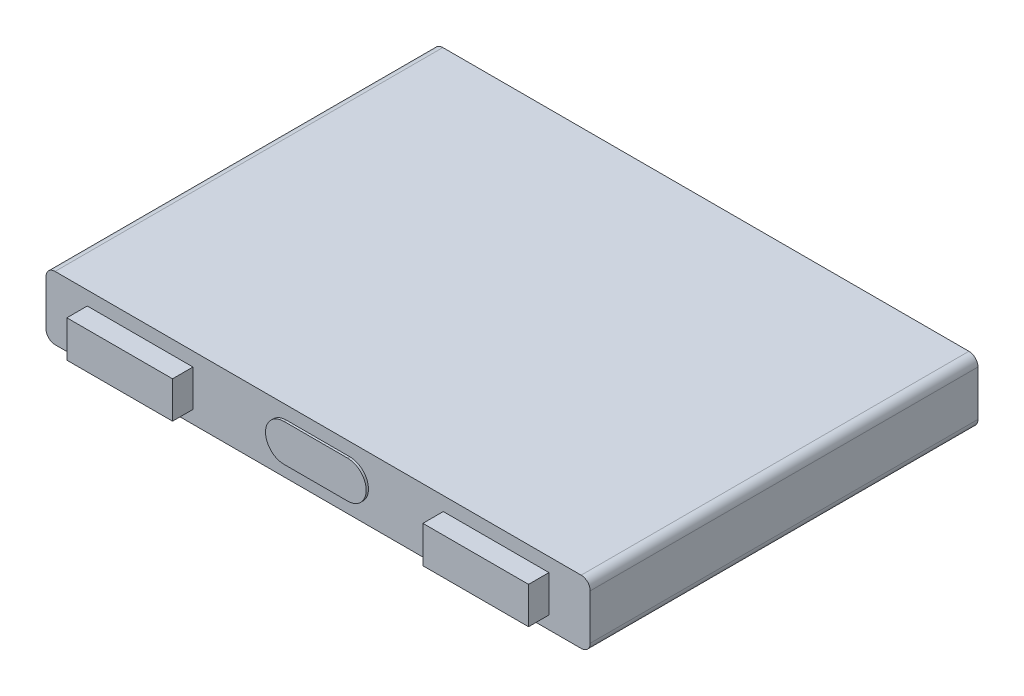
ISO-10303-21;
HEADER;
FILE_DESCRIPTION(('STEP AP214'),'2;1');
FILE_NAME('part.step','',(''),(''),'','','');
FILE_SCHEMA(('AUTOMOTIVE_DESIGN { 1 0 10303 214 1 1 1 1 }'));
ENDSEC;
DATA;
#1=APPLICATION_CONTEXT('core data for automotive mechanical design processes');
#2=APPLICATION_PROTOCOL_DEFINITION('international standard','automotive_design',2000,#1);
#3=PRODUCT_CONTEXT('',#1,'mechanical');
#4=PRODUCT('Part','Part','',(#3));
#5=PRODUCT_RELATED_PRODUCT_CATEGORY('part','',(#4));
#6=PRODUCT_DEFINITION_FORMATION('','',#4);
#7=PRODUCT_DEFINITION_CONTEXT('part definition',#1,'design');
#8=PRODUCT_DEFINITION('design','',#6,#7);
#9=PRODUCT_DEFINITION_SHAPE('','',#8);
#10=(LENGTH_UNIT() NAMED_UNIT(*) SI_UNIT(.MILLI.,.METRE.));
#11=(NAMED_UNIT(*) PLANE_ANGLE_UNIT() SI_UNIT($,.RADIAN.));
#12=(NAMED_UNIT(*) SI_UNIT($,.STERADIAN.) SOLID_ANGLE_UNIT());
#13=UNCERTAINTY_MEASURE_WITH_UNIT(LENGTH_MEASURE(1.E-05),#10,'distance_accuracy_value','');
#14=(GEOMETRIC_REPRESENTATION_CONTEXT(3) GLOBAL_UNCERTAINTY_ASSIGNED_CONTEXT((#13)) GLOBAL_UNIT_ASSIGNED_CONTEXT((#10,
#11,#12)) REPRESENTATION_CONTEXT('',''));
#15=CARTESIAN_POINT('',(0.,0.,0.));
#16=DIRECTION('',(0.,0.,1.));
#17=DIRECTION('',(1.,0.,0.));
#18=AXIS2_PLACEMENT_3D('',#15,#16,#17);
#19=CARTESIAN_POINT('',(-60.,14.,42.75));
#20=DIRECTION('',(0.,0.,-1.));
#21=DIRECTION('',(-1.,0.,0.));
#22=AXIS2_PLACEMENT_3D('',#19,#20,#21);
#23=PLANE('',#22);
#24=DIRECTION('',(1.,0.,0.));
#25=VECTOR('',#24,1.);
#26=CARTESIAN_POINT('',(0.,2.9,42.75));
#27=LINE('',#26,#25);
#28=CARTESIAN_POINT('',(-7.,2.9,42.75));
#29=VERTEX_POINT('',#28);
#30=CARTESIAN_POINT('',(7.,2.9,42.75));
#31=VERTEX_POINT('',#30);
#32=EDGE_CURVE('E202',#29,#31,#27,.T.);
#33=ORIENTED_EDGE('',*,*,#32,.F.);
#34=CARTESIAN_POINT('',(-7.,7.,42.75));
#35=DIRECTION('',(0.,0.,1.));
#36=DIRECTION('',(1.,0.,0.));
#37=AXIS2_PLACEMENT_3D('',#34,#35,#36);
#38=CIRCLE('',#37,4.1);
#39=CARTESIAN_POINT('',(-7.,11.1,42.75));
#40=VERTEX_POINT('',#39);
#41=EDGE_CURVE('E199',#40,#29,#38,.T.);
#42=ORIENTED_EDGE('',*,*,#41,.F.);
#43=DIRECTION('',(1.,0.,0.));
#44=VECTOR('',#43,1.);
#45=CARTESIAN_POINT('',(0.,11.1,42.75));
#46=LINE('',#45,#44);
#47=CARTESIAN_POINT('',(7.,11.1,42.75));
#48=VERTEX_POINT('',#47);
#49=EDGE_CURVE('E62',#40,#48,#46,.T.);
#50=ORIENTED_EDGE('',*,*,#49,.T.);
#51=CARTESIAN_POINT('',(7.,7.,42.75));
#52=DIRECTION('',(0.,0.,1.));
#53=DIRECTION('',(1.,0.,0.));
#54=AXIS2_PLACEMENT_3D('',#51,#52,#53);
#55=CIRCLE('',#54,4.1);
#56=EDGE_CURVE('E57',#31,#48,#55,.T.);
#57=ORIENTED_EDGE('',*,*,#56,.F.);
#58=EDGE_LOOP('',(#33,#42,#50,#57));
#59=FACE_BOUND('',#58,.T.);
#60=DIRECTION('',(0.,-1.,0.));
#61=VECTOR('',#60,1.);
#62=CARTESIAN_POINT('',(-50.9,2.84456170119811,42.75));
#63=LINE('',#62,#61);
#64=CARTESIAN_POINT('',(-50.9,10.9445617011981,42.75));
#65=VERTEX_POINT('',#64);
#66=CARTESIAN_POINT('',(-50.9,2.84456170119811,42.75));
#67=VERTEX_POINT('',#66);
#68=EDGE_CURVE('E255',#65,#67,#63,.T.);
#69=ORIENTED_EDGE('',*,*,#68,.F.);
#70=DIRECTION('',(-1.,0.,0.));
#71=VECTOR('',#70,1.);
#72=CARTESIAN_POINT('',(-27.6,10.9445617011981,42.75));
#73=LINE('',#72,#71);
#74=CARTESIAN_POINT('',(-27.6,10.9445617011981,42.75));
#75=VERTEX_POINT('',#74);
#76=EDGE_CURVE('E261',#75,#65,#73,.T.);
#77=ORIENTED_EDGE('',*,*,#76,.F.);
#78=DIRECTION('',(0.,1.,0.));
#79=VECTOR('',#78,1.);
#80=CARTESIAN_POINT('',(-27.6,2.84456170119811,42.75));
#81=LINE('',#80,#79);
#82=CARTESIAN_POINT('',(-27.6,2.84456170119811,42.75));
#83=VERTEX_POINT('',#82);
#84=EDGE_CURVE('E278',#83,#75,#81,.T.);
#85=ORIENTED_EDGE('',*,*,#84,.F.);
#86=DIRECTION('',(1.,0.,0.));
#87=VECTOR('',#86,1.);
#88=CARTESIAN_POINT('',(-27.6,2.84456170119811,42.75));
#89=LINE('',#88,#87);
#90=EDGE_CURVE('E274',#67,#83,#89,.T.);
#91=ORIENTED_EDGE('',*,*,#90,.F.);
#92=EDGE_LOOP('',(#69,#77,#85,#91));
#93=FACE_BOUND('',#92,.T.);
#94=DIRECTION('',(1.,0.,0.));
#95=VECTOR('',#94,1.);
#96=CARTESIAN_POINT('',(-60.,14.,42.75));
#97=LINE('',#96,#95);
#98=CARTESIAN_POINT('',(-58.,14.,42.75));
#99=VERTEX_POINT('',#98);
#100=CARTESIAN_POINT('',(58.,14.,42.75));
#101=VERTEX_POINT('',#100);
#102=EDGE_CURVE('E305',#99,#101,#97,.T.);
#103=ORIENTED_EDGE('',*,*,#102,.F.);
#104=CARTESIAN_POINT('',(-58.,12.,42.75));
#105=DIRECTION('',(0.,0.,-1.));
#106=DIRECTION('',(-1.,0.,0.));
#107=AXIS2_PLACEMENT_3D('',#104,#105,#106);
#108=CIRCLE('',#107,2.);
#109=CARTESIAN_POINT('',(-60.,12.,42.75));
#110=VERTEX_POINT('',#109);
#111=EDGE_CURVE('E349',#99,#110,#108,.F.);
#112=ORIENTED_EDGE('',*,*,#111,.T.);
#113=DIRECTION('',(0.,-1.,0.));
#114=VECTOR('',#113,1.);
#115=CARTESIAN_POINT('',(-60.,14.,42.75));
#116=LINE('',#115,#114);
#117=CARTESIAN_POINT('',(-60.,2.,42.75));
#118=VERTEX_POINT('',#117);
#119=EDGE_CURVE('E320',#110,#118,#116,.T.);
#120=ORIENTED_EDGE('',*,*,#119,.T.);
#121=CARTESIAN_POINT('',(-58.,2.,42.75));
#122=DIRECTION('',(0.,0.,-1.));
#123=DIRECTION('',(-1.,0.,0.));
#124=AXIS2_PLACEMENT_3D('',#121,#122,#123);
#125=CIRCLE('',#124,2.);
#126=CARTESIAN_POINT('',(-58.,0.,42.75));
#127=VERTEX_POINT('',#126);
#128=EDGE_CURVE('E346',#118,#127,#125,.F.);
#129=ORIENTED_EDGE('',*,*,#128,.T.);
#130=DIRECTION('',(1.,0.,0.));
#131=VECTOR('',#130,1.);
#132=CARTESIAN_POINT('',(-60.,0.,42.75));
#133=LINE('',#132,#131);
#134=CARTESIAN_POINT('',(58.,0.,42.75));
#135=VERTEX_POINT('',#134);
#136=EDGE_CURVE('E306',#127,#135,#133,.T.);
#137=ORIENTED_EDGE('',*,*,#136,.T.);
#138=CARTESIAN_POINT('',(58.,2.,42.75));
#139=DIRECTION('',(0.,0.,-1.));
#140=DIRECTION('',(-1.,0.,0.));
#141=AXIS2_PLACEMENT_3D('',#138,#139,#140);
#142=CIRCLE('',#141,2.);
#143=CARTESIAN_POINT('',(60.,2.,42.75));
#144=VERTEX_POINT('',#143);
#145=EDGE_CURVE('E343',#135,#144,#142,.F.);
#146=ORIENTED_EDGE('',*,*,#145,.T.);
#147=DIRECTION('',(0.,-1.,0.));
#148=VECTOR('',#147,1.);
#149=CARTESIAN_POINT('',(60.,14.,42.75));
#150=LINE('',#149,#148);
#151=CARTESIAN_POINT('',(60.,12.,42.75));
#152=VERTEX_POINT('',#151);
#153=EDGE_CURVE('E310',#152,#144,#150,.T.);
#154=ORIENTED_EDGE('',*,*,#153,.F.);
#155=CARTESIAN_POINT('',(58.,12.,42.75));
#156=DIRECTION('',(0.,0.,-1.));
#157=DIRECTION('',(-1.,0.,0.));
#158=AXIS2_PLACEMENT_3D('',#155,#156,#157);
#159=CIRCLE('',#158,2.);
#160=EDGE_CURVE('E340',#152,#101,#159,.F.);
#161=ORIENTED_EDGE('',*,*,#160,.T.);
#162=EDGE_LOOP('',(#103,#112,#120,#129,#137,#146,#154,#161));
#163=FACE_BOUND('',#162,.T.);
#164=DIRECTION('',(0.,-1.,0.));
#165=VECTOR('',#164,1.);
#166=CARTESIAN_POINT('',(27.6,2.84456170119814,42.75));
#167=LINE('',#166,#165);
#168=CARTESIAN_POINT('',(27.6,10.9445617011981,42.75));
#169=VERTEX_POINT('',#168);
#170=CARTESIAN_POINT('',(27.6,2.84456170119814,42.75));
#171=VERTEX_POINT('',#170);
#172=EDGE_CURVE('E204',#169,#171,#167,.T.);
#173=ORIENTED_EDGE('',*,*,#172,.F.);
#174=DIRECTION('',(-1.,0.,0.));
#175=VECTOR('',#174,1.);
#176=CARTESIAN_POINT('',(27.6,10.9445617011981,42.75));
#177=LINE('',#176,#175);
#178=CARTESIAN_POINT('',(50.9,10.9445617011982,42.75));
#179=VERTEX_POINT('',#178);
#180=EDGE_CURVE('E220',#179,#169,#177,.T.);
#181=ORIENTED_EDGE('',*,*,#180,.F.);
#182=DIRECTION('',(0.,1.,0.));
#183=VECTOR('',#182,1.);
#184=CARTESIAN_POINT('',(50.9,2.84456170119816,42.75));
#185=LINE('',#184,#183);
#186=CARTESIAN_POINT('',(50.9,2.84456170119816,42.75));
#187=VERTEX_POINT('',#186);
#188=EDGE_CURVE('E233',#187,#179,#185,.T.);
#189=ORIENTED_EDGE('',*,*,#188,.F.);
#190=DIRECTION('',(1.,0.,0.));
#191=VECTOR('',#190,1.);
#192=CARTESIAN_POINT('',(27.6,2.84456170119814,42.75));
#193=LINE('',#192,#191);
#194=EDGE_CURVE('E209',#171,#187,#193,.T.);
#195=ORIENTED_EDGE('',*,*,#194,.F.);
#196=EDGE_LOOP('',(#173,#181,#189,#195));
#197=FACE_BOUND('',#196,.T.);
#198=ADVANCED_FACE('F41',(#59,#93,#163,#197),#23,.F.);
#199=CARTESIAN_POINT('',(60.,14.,-42.75));
#200=DIRECTION('',(-1.,0.,0.));
#201=DIRECTION('',(0.,0.,1.));
#202=AXIS2_PLACEMENT_3D('',#199,#200,#201);
#203=PLANE('',#202);
#204=ORIENTED_EDGE('',*,*,#153,.T.);
#205=DIRECTION('',(0.,0.,-1.));
#206=VECTOR('',#205,1.);
#207=CARTESIAN_POINT('',(60.,2.,-42.75));
#208=LINE('',#207,#206);
#209=CARTESIAN_POINT('',(60.,2.,-42.75));
#210=VERTEX_POINT('',#209);
#211=EDGE_CURVE('E11',#144,#210,#208,.T.);
#212=ORIENTED_EDGE('',*,*,#211,.T.);
#213=DIRECTION('',(0.,-1.,0.));
#214=VECTOR('',#213,1.);
#215=CARTESIAN_POINT('',(60.,14.,-42.75));
#216=LINE('',#215,#214);
#217=CARTESIAN_POINT('',(60.,12.,-42.75));
#218=VERTEX_POINT('',#217);
#219=EDGE_CURVE('E328',#218,#210,#216,.T.);
#220=ORIENTED_EDGE('',*,*,#219,.F.);
#221=DIRECTION('',(0.,0.,-1.));
#222=VECTOR('',#221,1.);
#223=CARTESIAN_POINT('',(60.,12.,42.75));
#224=LINE('',#223,#222);
#225=EDGE_CURVE('E50',#218,#152,#224,.F.);
#226=ORIENTED_EDGE('',*,*,#225,.T.);
#227=EDGE_LOOP('',(#204,#212,#220,#226));
#228=FACE_BOUND('',#227,.T.);
#229=ADVANCED_FACE('F381',(#228),#203,.F.);
#230=CARTESIAN_POINT('',(-60.,14.,-42.75));
#231=DIRECTION('',(0.,0.,1.));
#232=DIRECTION('',(1.,0.,0.));
#233=AXIS2_PLACEMENT_3D('',#230,#231,#232);
#234=PLANE('',#233);
#235=DIRECTION('',(0.,-1.,0.));
#236=VECTOR('',#235,1.);
#237=CARTESIAN_POINT('',(-60.,14.,-42.75));
#238=LINE('',#237,#236);
#239=CARTESIAN_POINT('',(-60.,12.,-42.75));
#240=VERTEX_POINT('',#239);
#241=CARTESIAN_POINT('',(-60.,2.,-42.75));
#242=VERTEX_POINT('',#241);
#243=EDGE_CURVE('E324',#240,#242,#238,.T.);
#244=ORIENTED_EDGE('',*,*,#243,.F.);
#245=CARTESIAN_POINT('',(-58.,12.,-42.75));
#246=DIRECTION('',(0.,0.,1.));
#247=DIRECTION('',(1.,0.,0.));
#248=AXIS2_PLACEMENT_3D('',#245,#246,#247);
#249=CIRCLE('',#248,2.);
#250=CARTESIAN_POINT('',(-58.,14.,-42.75));
#251=VERTEX_POINT('',#250);
#252=EDGE_CURVE('E368',#240,#251,#249,.F.);
#253=ORIENTED_EDGE('',*,*,#252,.T.);
#254=DIRECTION('',(-1.,0.,0.));
#255=VECTOR('',#254,1.);
#256=CARTESIAN_POINT('',(-60.,14.,-42.75));
#257=LINE('',#256,#255);
#258=CARTESIAN_POINT('',(58.,14.,-42.75));
#259=VERTEX_POINT('',#258);
#260=EDGE_CURVE('E301',#259,#251,#257,.T.);
#261=ORIENTED_EDGE('',*,*,#260,.F.);
#262=CARTESIAN_POINT('',(58.,12.,-42.75));
#263=DIRECTION('',(0.,0.,1.));
#264=DIRECTION('',(1.,0.,0.));
#265=AXIS2_PLACEMENT_3D('',#262,#263,#264);
#266=CIRCLE('',#265,2.);
#267=EDGE_CURVE('E359',#259,#218,#266,.F.);
#268=ORIENTED_EDGE('',*,*,#267,.T.);
#269=ORIENTED_EDGE('',*,*,#219,.T.);
#270=CARTESIAN_POINT('',(58.,2.,-42.75));
#271=DIRECTION('',(0.,0.,1.));
#272=DIRECTION('',(1.,0.,0.));
#273=AXIS2_PLACEMENT_3D('',#270,#271,#272);
#274=CIRCLE('',#273,2.);
#275=CARTESIAN_POINT('',(58.,0.,-42.75));
#276=VERTEX_POINT('',#275);
#277=EDGE_CURVE('E362',#210,#276,#274,.F.);
#278=ORIENTED_EDGE('',*,*,#277,.T.);
#279=DIRECTION('',(-1.,0.,0.));
#280=VECTOR('',#279,1.);
#281=CARTESIAN_POINT('',(-60.,0.,-42.75));
#282=LINE('',#281,#280);
#283=CARTESIAN_POINT('',(-58.,0.,-42.75));
#284=VERTEX_POINT('',#283);
#285=EDGE_CURVE('E300',#276,#284,#282,.T.);
#286=ORIENTED_EDGE('',*,*,#285,.T.);
#287=CARTESIAN_POINT('',(-58.,2.,-42.75));
#288=DIRECTION('',(0.,0.,1.));
#289=DIRECTION('',(1.,0.,0.));
#290=AXIS2_PLACEMENT_3D('',#287,#288,#289);
#291=CIRCLE('',#290,2.);
#292=EDGE_CURVE('E365',#284,#242,#291,.F.);
#293=ORIENTED_EDGE('',*,*,#292,.T.);
#294=EDGE_LOOP('',(#244,#253,#261,#268,#269,#278,#286,#293));
#295=FACE_BOUND('',#294,.T.);
#296=ADVANCED_FACE('F396',(#295),#234,.F.);
#297=CARTESIAN_POINT('',(-60.,14.,-42.75));
#298=DIRECTION('',(1.,0.,0.));
#299=DIRECTION('',(0.,0.,-1.));
#300=AXIS2_PLACEMENT_3D('',#297,#298,#299);
#301=PLANE('',#300);
#302=ORIENTED_EDGE('',*,*,#119,.F.);
#303=DIRECTION('',(0.,0.,1.));
#304=VECTOR('',#303,1.);
#305=CARTESIAN_POINT('',(-60.,12.,-42.75));
#306=LINE('',#305,#304);
#307=EDGE_CURVE('E356',#110,#240,#306,.F.);
#308=ORIENTED_EDGE('',*,*,#307,.T.);
#309=ORIENTED_EDGE('',*,*,#243,.T.);
#310=DIRECTION('',(0.,0.,1.));
#311=VECTOR('',#310,1.);
#312=CARTESIAN_POINT('',(-60.,2.,-42.75));
#313=LINE('',#312,#311);
#314=EDGE_CURVE('E352',#242,#118,#313,.T.);
#315=ORIENTED_EDGE('',*,*,#314,.T.);
#316=EDGE_LOOP('',(#302,#308,#309,#315));
#317=FACE_BOUND('',#316,.T.);
#318=ADVANCED_FACE('F403',(#317),#301,.F.);
#319=CARTESIAN_POINT('',(0.,14.,0.));
#320=DIRECTION('',(0.,1.,0.));
#321=DIRECTION('',(0.,0.,1.));
#322=AXIS2_PLACEMENT_3D('',#319,#320,#321);
#323=PLANE('',#322);
#324=ORIENTED_EDGE('',*,*,#260,.T.);
#325=DIRECTION('',(0.,0.,1.));
#326=VECTOR('',#325,1.);
#327=CARTESIAN_POINT('',(-58.,14.,42.75));
#328=LINE('',#327,#326);
#329=EDGE_CURVE('E336',#251,#99,#328,.T.);
#330=ORIENTED_EDGE('',*,*,#329,.T.);
#331=ORIENTED_EDGE('',*,*,#102,.T.);
#332=DIRECTION('',(0.,0.,-1.));
#333=VECTOR('',#332,1.);
#334=CARTESIAN_POINT('',(58.,14.,-42.75));
#335=LINE('',#334,#333);
#336=EDGE_CURVE('E332',#101,#259,#335,.T.);
#337=ORIENTED_EDGE('',*,*,#336,.T.);
#338=EDGE_LOOP('',(#324,#330,#331,#337));
#339=FACE_BOUND('',#338,.T.);
#340=ADVANCED_FACE('F392',(#339),#323,.T.);
#341=CARTESIAN_POINT('',(0.,0.,0.));
#342=DIRECTION('',(0.,1.,0.));
#343=DIRECTION('',(0.,0.,1.));
#344=AXIS2_PLACEMENT_3D('',#341,#342,#343);
#345=PLANE('',#344);
#346=ORIENTED_EDGE('',*,*,#136,.F.);
#347=DIRECTION('',(0.,0.,1.));
#348=VECTOR('',#347,1.);
#349=CARTESIAN_POINT('',(-58.,0.,0.));
#350=LINE('',#349,#348);
#351=EDGE_CURVE('E374',#127,#284,#350,.F.);
#352=ORIENTED_EDGE('',*,*,#351,.T.);
#353=ORIENTED_EDGE('',*,*,#285,.F.);
#354=DIRECTION('',(0.,0.,-1.));
#355=VECTOR('',#354,1.);
#356=CARTESIAN_POINT('',(58.,0.,0.));
#357=LINE('',#356,#355);
#358=EDGE_CURVE('E371',#276,#135,#357,.F.);
#359=ORIENTED_EDGE('',*,*,#358,.T.);
#360=EDGE_LOOP('',(#346,#352,#353,#359));
#361=FACE_BOUND('',#360,.T.);
#362=ADVANCED_FACE('F411',(#361),#345,.F.);
#363=CARTESIAN_POINT('',(-50.9,2.84456170119811,47.25));
#364=DIRECTION('',(1.,0.,0.));
#365=DIRECTION('',(0.,0.,-1.));
#366=AXIS2_PLACEMENT_3D('',#363,#364,#365);
#367=PLANE('',#366);
#368=ORIENTED_EDGE('',*,*,#68,.T.);
#369=DIRECTION('',(0.,0.,-1.));
#370=VECTOR('',#369,1.);
#371=CARTESIAN_POINT('',(-50.9,2.84456170119811,47.25));
#372=LINE('',#371,#370);
#373=CARTESIAN_POINT('',(-50.9,2.84456170119811,47.25));
#374=VERTEX_POINT('',#373);
#375=EDGE_CURVE('E296',#374,#67,#372,.T.);
#376=ORIENTED_EDGE('',*,*,#375,.F.);
#377=DIRECTION('',(0.,-1.,0.));
#378=VECTOR('',#377,1.);
#379=CARTESIAN_POINT('',(-50.9,2.84456170119811,47.25));
#380=LINE('',#379,#378);
#381=CARTESIAN_POINT('',(-50.9,10.9445617011981,47.25));
#382=VERTEX_POINT('',#381);
#383=EDGE_CURVE('E256',#382,#374,#380,.T.);
#384=ORIENTED_EDGE('',*,*,#383,.F.);
#385=DIRECTION('',(0.,0.,-1.));
#386=VECTOR('',#385,1.);
#387=CARTESIAN_POINT('',(-50.9,10.9445617011981,47.25));
#388=LINE('',#387,#386);
#389=EDGE_CURVE('E270',#382,#65,#388,.T.);
#390=ORIENTED_EDGE('',*,*,#389,.T.);
#391=EDGE_LOOP('',(#368,#376,#384,#390));
#392=FACE_BOUND('',#391,.T.);
#393=ADVANCED_FACE('F479',(#392),#367,.F.);
#394=CARTESIAN_POINT('',(-27.6,2.84456170119811,47.25));
#395=DIRECTION('',(0.,1.,0.));
#396=DIRECTION('',(-1.,0.,0.));
#397=AXIS2_PLACEMENT_3D('',#394,#395,#396);
#398=PLANE('',#397);
#399=ORIENTED_EDGE('',*,*,#90,.T.);
#400=DIRECTION('',(0.,0.,-1.));
#401=VECTOR('',#400,1.);
#402=CARTESIAN_POINT('',(-27.6,2.84456170119811,47.25));
#403=LINE('',#402,#401);
#404=CARTESIAN_POINT('',(-27.6,2.84456170119811,47.25));
#405=VERTEX_POINT('',#404);
#406=EDGE_CURVE('E292',#405,#83,#403,.T.);
#407=ORIENTED_EDGE('',*,*,#406,.F.);
#408=DIRECTION('',(1.,0.,0.));
#409=VECTOR('',#408,1.);
#410=CARTESIAN_POINT('',(-27.6,2.84456170119811,47.25));
#411=LINE('',#410,#409);
#412=EDGE_CURVE('E260',#374,#405,#411,.T.);
#413=ORIENTED_EDGE('',*,*,#412,.F.);
#414=ORIENTED_EDGE('',*,*,#375,.T.);
#415=EDGE_LOOP('',(#399,#407,#413,#414));
#416=FACE_BOUND('',#415,.T.);
#417=ADVANCED_FACE('F475',(#416),#398,.F.);
#418=CARTESIAN_POINT('',(-27.6,2.84456170119811,47.25));
#419=DIRECTION('',(-1.,0.,0.));
#420=DIRECTION('',(0.,0.,1.));
#421=AXIS2_PLACEMENT_3D('',#418,#419,#420);
#422=PLANE('',#421);
#423=ORIENTED_EDGE('',*,*,#84,.T.);
#424=DIRECTION('',(0.,0.,-1.));
#425=VECTOR('',#424,1.);
#426=CARTESIAN_POINT('',(-27.6,10.9445617011981,47.25));
#427=LINE('',#426,#425);
#428=CARTESIAN_POINT('',(-27.6,10.9445617011981,47.25));
#429=VERTEX_POINT('',#428);
#430=EDGE_CURVE('E288',#429,#75,#427,.T.);
#431=ORIENTED_EDGE('',*,*,#430,.F.);
#432=DIRECTION('',(0.,1.,0.));
#433=VECTOR('',#432,1.);
#434=CARTESIAN_POINT('',(-27.6,2.84456170119811,47.25));
#435=LINE('',#434,#433);
#436=EDGE_CURVE('E264',#405,#429,#435,.T.);
#437=ORIENTED_EDGE('',*,*,#436,.F.);
#438=ORIENTED_EDGE('',*,*,#406,.T.);
#439=EDGE_LOOP('',(#423,#431,#437,#438));
#440=FACE_BOUND('',#439,.T.);
#441=ADVANCED_FACE('F471',(#440),#422,.F.);
#442=CARTESIAN_POINT('',(-27.6,10.9445617011981,47.25));
#443=DIRECTION('',(0.,-1.,0.));
#444=DIRECTION('',(1.,0.,0.));
#445=AXIS2_PLACEMENT_3D('',#442,#443,#444);
#446=PLANE('',#445);
#447=ORIENTED_EDGE('',*,*,#76,.T.);
#448=ORIENTED_EDGE('',*,*,#389,.F.);
#449=DIRECTION('',(-1.,0.,0.));
#450=VECTOR('',#449,1.);
#451=CARTESIAN_POINT('',(-27.6,10.9445617011981,47.25));
#452=LINE('',#451,#450);
#453=EDGE_CURVE('E267',#429,#382,#452,.T.);
#454=ORIENTED_EDGE('',*,*,#453,.F.);
#455=ORIENTED_EDGE('',*,*,#430,.T.);
#456=EDGE_LOOP('',(#447,#448,#454,#455));
#457=FACE_BOUND('',#456,.T.);
#458=ADVANCED_FACE('F467',(#457),#446,.F.);
#459=CARTESIAN_POINT('',(0.,0.,47.25));
#460=DIRECTION('',(0.,0.,1.));
#461=DIRECTION('',(1.,0.,0.));
#462=AXIS2_PLACEMENT_3D('',#459,#460,#461);
#463=PLANE('',#462);
#464=ORIENTED_EDGE('',*,*,#383,.T.);
#465=ORIENTED_EDGE('',*,*,#412,.T.);
#466=ORIENTED_EDGE('',*,*,#436,.T.);
#467=ORIENTED_EDGE('',*,*,#453,.T.);
#468=EDGE_LOOP('',(#464,#465,#466,#467));
#469=FACE_BOUND('',#468,.T.);
#470=ADVANCED_FACE('F463',(#469),#463,.T.);
#471=CARTESIAN_POINT('',(27.6,2.84456170119814,47.25));
#472=DIRECTION('',(1.,0.,0.));
#473=DIRECTION('',(0.,1.,0.));
#474=AXIS2_PLACEMENT_3D('',#471,#472,#473);
#475=PLANE('',#474);
#476=ORIENTED_EDGE('',*,*,#172,.T.);
#477=DIRECTION('',(0.,0.,-1.));
#478=VECTOR('',#477,1.);
#479=CARTESIAN_POINT('',(27.6,2.84456170119814,47.25));
#480=LINE('',#479,#478);
#481=CARTESIAN_POINT('',(27.6,2.84456170119814,47.25));
#482=VERTEX_POINT('',#481);
#483=EDGE_CURVE('E251',#482,#171,#480,.T.);
#484=ORIENTED_EDGE('',*,*,#483,.F.);
#485=DIRECTION('',(0.,-1.,0.));
#486=VECTOR('',#485,1.);
#487=CARTESIAN_POINT('',(27.6,2.84456170119814,47.25));
#488=LINE('',#487,#486);
#489=CARTESIAN_POINT('',(27.6,10.9445617011981,47.25));
#490=VERTEX_POINT('',#489);
#491=EDGE_CURVE('E215',#490,#482,#488,.T.);
#492=ORIENTED_EDGE('',*,*,#491,.F.);
#493=DIRECTION('',(0.,0.,-1.));
#494=VECTOR('',#493,1.);
#495=CARTESIAN_POINT('',(27.6,10.9445617011981,47.25));
#496=LINE('',#495,#494);
#497=EDGE_CURVE('E228',#490,#169,#496,.T.);
#498=ORIENTED_EDGE('',*,*,#497,.T.);
#499=EDGE_LOOP('',(#476,#484,#492,#498));
#500=FACE_BOUND('',#499,.T.);
#501=ADVANCED_FACE('F459',(#500),#475,.F.);
#502=CARTESIAN_POINT('',(27.6,2.84456170119814,47.25));
#503=DIRECTION('',(0.,1.,0.));
#504=DIRECTION('',(-1.,0.,0.));
#505=AXIS2_PLACEMENT_3D('',#502,#503,#504);
#506=PLANE('',#505);
#507=ORIENTED_EDGE('',*,*,#194,.T.);
#508=DIRECTION('',(0.,0.,-1.));
#509=VECTOR('',#508,1.);
#510=CARTESIAN_POINT('',(50.9,2.84456170119816,47.25));
#511=LINE('',#510,#509);
#512=CARTESIAN_POINT('',(50.9,2.84456170119816,47.25));
#513=VERTEX_POINT('',#512);
#514=EDGE_CURVE('E247',#513,#187,#511,.T.);
#515=ORIENTED_EDGE('',*,*,#514,.F.);
#516=DIRECTION('',(1.,0.,0.));
#517=VECTOR('',#516,1.);
#518=CARTESIAN_POINT('',(27.6,2.84456170119814,47.25));
#519=LINE('',#518,#517);
#520=EDGE_CURVE('E219',#482,#513,#519,.T.);
#521=ORIENTED_EDGE('',*,*,#520,.F.);
#522=ORIENTED_EDGE('',*,*,#483,.T.);
#523=EDGE_LOOP('',(#507,#515,#521,#522));
#524=FACE_BOUND('',#523,.T.);
#525=ADVANCED_FACE('F455',(#524),#506,.F.);
#526=CARTESIAN_POINT('',(50.9,2.84456170119816,47.25));
#527=DIRECTION('',(-1.,0.,0.));
#528=DIRECTION('',(0.,-1.,0.));
#529=AXIS2_PLACEMENT_3D('',#526,#527,#528);
#530=PLANE('',#529);
#531=ORIENTED_EDGE('',*,*,#188,.T.);
#532=DIRECTION('',(0.,0.,-1.));
#533=VECTOR('',#532,1.);
#534=CARTESIAN_POINT('',(50.9,10.9445617011982,47.25));
#535=LINE('',#534,#533);
#536=CARTESIAN_POINT('',(50.9,10.9445617011982,47.25));
#537=VERTEX_POINT('',#536);
#538=EDGE_CURVE('E243',#537,#179,#535,.T.);
#539=ORIENTED_EDGE('',*,*,#538,.F.);
#540=DIRECTION('',(0.,1.,0.));
#541=VECTOR('',#540,1.);
#542=CARTESIAN_POINT('',(50.9,2.84456170119816,47.25));
#543=LINE('',#542,#541);
#544=EDGE_CURVE('E223',#513,#537,#543,.T.);
#545=ORIENTED_EDGE('',*,*,#544,.F.);
#546=ORIENTED_EDGE('',*,*,#514,.T.);
#547=EDGE_LOOP('',(#531,#539,#545,#546));
#548=FACE_BOUND('',#547,.T.);
#549=ADVANCED_FACE('F447',(#548),#530,.F.);
#550=CARTESIAN_POINT('',(27.6,10.9445617011981,47.25));
#551=DIRECTION('',(0.,-1.,0.));
#552=DIRECTION('',(1.,0.,0.));
#553=AXIS2_PLACEMENT_3D('',#550,#551,#552);
#554=PLANE('',#553);
#555=ORIENTED_EDGE('',*,*,#180,.T.);
#556=ORIENTED_EDGE('',*,*,#497,.F.);
#557=DIRECTION('',(-1.,0.,0.));
#558=VECTOR('',#557,1.);
#559=CARTESIAN_POINT('',(27.6,10.9445617011981,47.25));
#560=LINE('',#559,#558);
#561=EDGE_CURVE('E226',#537,#490,#560,.T.);
#562=ORIENTED_EDGE('',*,*,#561,.F.);
#563=ORIENTED_EDGE('',*,*,#538,.T.);
#564=EDGE_LOOP('',(#555,#556,#562,#563));
#565=FACE_BOUND('',#564,.T.);
#566=ADVANCED_FACE('F441',(#565),#554,.F.);
#567=CARTESIAN_POINT('',(0.,0.,47.25));
#568=DIRECTION('',(0.,0.,-1.));
#569=DIRECTION('',(-1.,0.,0.));
#570=AXIS2_PLACEMENT_3D('',#567,#568,#569);
#571=PLANE('',#570);
#572=ORIENTED_EDGE('',*,*,#491,.T.);
#573=ORIENTED_EDGE('',*,*,#520,.T.);
#574=ORIENTED_EDGE('',*,*,#544,.T.);
#575=ORIENTED_EDGE('',*,*,#561,.T.);
#576=EDGE_LOOP('',(#572,#573,#574,#575));
#577=FACE_BOUND('',#576,.T.);
#578=ADVANCED_FACE('F437',(#577),#571,.F.);
#579=CARTESIAN_POINT('',(-58.,12.,0.));
#580=DIRECTION('',(0.,0.,-1.));
#581=DIRECTION('',(-1.,0.,0.));
#582=AXIS2_PLACEMENT_3D('',#579,#580,#581);
#583=CYLINDRICAL_SURFACE('',#582,2.);
#584=ORIENTED_EDGE('',*,*,#252,.F.);
#585=ORIENTED_EDGE('',*,*,#307,.F.);
#586=ORIENTED_EDGE('',*,*,#111,.F.);
#587=ORIENTED_EDGE('',*,*,#329,.F.);
#588=EDGE_LOOP('',(#584,#585,#586,#587));
#589=FACE_BOUND('',#588,.T.);
#590=ADVANCED_FACE('F400',(#589),#583,.T.);
#591=CARTESIAN_POINT('',(-58.,2.,-42.75));
#592=DIRECTION('',(0.,0.,1.));
#593=DIRECTION('',(1.,0.,0.));
#594=AXIS2_PLACEMENT_3D('',#591,#592,#593);
#595=CYLINDRICAL_SURFACE('',#594,2.);
#596=ORIENTED_EDGE('',*,*,#292,.F.);
#597=ORIENTED_EDGE('',*,*,#351,.F.);
#598=ORIENTED_EDGE('',*,*,#128,.F.);
#599=ORIENTED_EDGE('',*,*,#314,.F.);
#600=EDGE_LOOP('',(#596,#597,#598,#599));
#601=FACE_BOUND('',#600,.T.);
#602=ADVANCED_FACE('F407',(#601),#595,.T.);
#603=CARTESIAN_POINT('',(58.,2.,-42.75));
#604=DIRECTION('',(0.,0.,-1.));
#605=DIRECTION('',(-1.,0.,0.));
#606=AXIS2_PLACEMENT_3D('',#603,#604,#605);
#607=CYLINDRICAL_SURFACE('',#606,2.);
#608=ORIENTED_EDGE('',*,*,#145,.F.);
#609=ORIENTED_EDGE('',*,*,#358,.F.);
#610=ORIENTED_EDGE('',*,*,#277,.F.);
#611=ORIENTED_EDGE('',*,*,#211,.F.);
#612=EDGE_LOOP('',(#608,#609,#610,#611));
#613=FACE_BOUND('',#612,.T.);
#614=ADVANCED_FACE('F415',(#613),#607,.T.);
#615=CARTESIAN_POINT('',(58.,12.,0.));
#616=DIRECTION('',(0.,0.,1.));
#617=DIRECTION('',(1.,0.,0.));
#618=AXIS2_PLACEMENT_3D('',#615,#616,#617);
#619=CYLINDRICAL_SURFACE('',#618,2.);
#620=ORIENTED_EDGE('',*,*,#160,.F.);
#621=ORIENTED_EDGE('',*,*,#225,.F.);
#622=ORIENTED_EDGE('',*,*,#267,.F.);
#623=ORIENTED_EDGE('',*,*,#336,.F.);
#624=EDGE_LOOP('',(#620,#621,#622,#623));
#625=FACE_BOUND('',#624,.T.);
#626=ADVANCED_FACE('F43',(#625),#619,.T.);
#627=CARTESIAN_POINT('',(0.,2.9,43.25));
#628=DIRECTION('',(0.,1.,0.));
#629=DIRECTION('',(0.,0.,1.));
#630=AXIS2_PLACEMENT_3D('',#627,#628,#629);
#631=PLANE('',#630);
#632=ORIENTED_EDGE('',*,*,#32,.T.);
#633=DIRECTION('',(0.,0.,-1.));
#634=VECTOR('',#633,1.);
#635=CARTESIAN_POINT('',(7.,2.9,43.25));
#636=LINE('',#635,#634);
#637=CARTESIAN_POINT('',(7.,2.9,43.25));
#638=VERTEX_POINT('',#637);
#639=EDGE_CURVE('E181',#638,#31,#636,.T.);
#640=ORIENTED_EDGE('',*,*,#639,.F.);
#641=DIRECTION('',(1.,0.,0.));
#642=VECTOR('',#641,1.);
#643=CARTESIAN_POINT('',(0.,2.9,43.25));
#644=LINE('',#643,#642);
#645=CARTESIAN_POINT('',(-7.,2.9,43.25));
#646=VERTEX_POINT('',#645);
#647=EDGE_CURVE('E189',#646,#638,#644,.T.);
#648=ORIENTED_EDGE('',*,*,#647,.F.);
#649=DIRECTION('',(0.,0.,-1.));
#650=VECTOR('',#649,1.);
#651=CARTESIAN_POINT('',(-7.,2.9,43.25));
#652=LINE('',#651,#650);
#653=EDGE_CURVE('E635',#646,#29,#652,.T.);
#654=ORIENTED_EDGE('',*,*,#653,.T.);
#655=EDGE_LOOP('',(#632,#640,#648,#654));
#656=FACE_BOUND('',#655,.T.);
#657=ADVANCED_FACE('F201',(#656),#631,.F.);
#658=CARTESIAN_POINT('',(7.,7.,43.25));
#659=DIRECTION('',(0.,0.,-1.));
#660=DIRECTION('',(-1.,0.,0.));
#661=AXIS2_PLACEMENT_3D('',#658,#659,#660);
#662=CYLINDRICAL_SURFACE('',#661,4.1);
#663=ORIENTED_EDGE('',*,*,#56,.T.);
#664=DIRECTION('',(0.,0.,-1.));
#665=VECTOR('',#664,1.);
#666=CARTESIAN_POINT('',(7.,11.1,43.25));
#667=LINE('',#666,#665);
#668=CARTESIAN_POINT('',(7.,11.1,43.25));
#669=VERTEX_POINT('',#668);
#670=EDGE_CURVE('E183',#669,#48,#667,.T.);
#671=ORIENTED_EDGE('',*,*,#670,.F.);
#672=CARTESIAN_POINT('',(7.,7.,43.25));
#673=DIRECTION('',(0.,0.,1.));
#674=DIRECTION('',(1.,0.,0.));
#675=AXIS2_PLACEMENT_3D('',#672,#673,#674);
#676=CIRCLE('',#675,4.1);
#677=EDGE_CURVE('E177',#638,#669,#676,.T.);
#678=ORIENTED_EDGE('',*,*,#677,.F.);
#679=ORIENTED_EDGE('',*,*,#639,.T.);
#680=EDGE_LOOP('',(#663,#671,#678,#679));
#681=FACE_BOUND('',#680,.T.);
#682=ADVANCED_FACE('F179',(#681),#662,.T.);
#683=CARTESIAN_POINT('',(0.,11.1,43.25));
#684=DIRECTION('',(0.,1.,0.));
#685=DIRECTION('',(0.,0.,1.));
#686=AXIS2_PLACEMENT_3D('',#683,#684,#685);
#687=PLANE('',#686);
#688=ORIENTED_EDGE('',*,*,#49,.F.);
#689=DIRECTION('',(0.,0.,-1.));
#690=VECTOR('',#689,1.);
#691=CARTESIAN_POINT('',(-7.,11.1,43.25));
#692=LINE('',#691,#690);
#693=CARTESIAN_POINT('',(-7.,11.1,43.25));
#694=VERTEX_POINT('',#693);
#695=EDGE_CURVE('E211',#694,#40,#692,.T.);
#696=ORIENTED_EDGE('',*,*,#695,.F.);
#697=DIRECTION('',(1.,0.,0.));
#698=VECTOR('',#697,1.);
#699=CARTESIAN_POINT('',(0.,11.1,43.25));
#700=LINE('',#699,#698);
#701=EDGE_CURVE('E188',#694,#669,#700,.T.);
#702=ORIENTED_EDGE('',*,*,#701,.T.);
#703=ORIENTED_EDGE('',*,*,#670,.T.);
#704=EDGE_LOOP('',(#688,#696,#702,#703));
#705=FACE_BOUND('',#704,.T.);
#706=ADVANCED_FACE('F603',(#705),#687,.T.);
#707=CARTESIAN_POINT('',(-7.,7.,43.25));
#708=DIRECTION('',(0.,0.,-1.));
#709=DIRECTION('',(-1.,0.,0.));
#710=AXIS2_PLACEMENT_3D('',#707,#708,#709);
#711=CYLINDRICAL_SURFACE('',#710,4.1);
#712=ORIENTED_EDGE('',*,*,#41,.T.);
#713=ORIENTED_EDGE('',*,*,#653,.F.);
#714=CARTESIAN_POINT('',(-7.,7.,43.25));
#715=DIRECTION('',(0.,0.,1.));
#716=DIRECTION('',(1.,0.,0.));
#717=AXIS2_PLACEMENT_3D('',#714,#715,#716);
#718=CIRCLE('',#717,4.1);
#719=EDGE_CURVE('E194',#694,#646,#718,.T.);
#720=ORIENTED_EDGE('',*,*,#719,.F.);
#721=ORIENTED_EDGE('',*,*,#695,.T.);
#722=EDGE_LOOP('',(#712,#713,#720,#721));
#723=FACE_BOUND('',#722,.T.);
#724=ADVANCED_FACE('F611',(#723),#711,.T.);
#725=CARTESIAN_POINT('',(0.,0.,43.25));
#726=DIRECTION('',(0.,0.,1.));
#727=DIRECTION('',(1.,0.,0.));
#728=AXIS2_PLACEMENT_3D('',#725,#726,#727);
#729=PLANE('',#728);
#730=ORIENTED_EDGE('',*,*,#647,.T.);
#731=ORIENTED_EDGE('',*,*,#677,.T.);
#732=ORIENTED_EDGE('',*,*,#701,.F.);
#733=ORIENTED_EDGE('',*,*,#719,.T.);
#734=EDGE_LOOP('',(#730,#731,#732,#733));
#735=FACE_BOUND('',#734,.T.);
#736=ADVANCED_FACE('F192',(#735),#729,.T.);
#737=CLOSED_SHELL('',(#198,#229,#296,#318,#340,#362,#393,#417,#441,#458,#470,#501,#525,#549,
#566,#578,#590,#602,#614,#626,#657,#682,#706,#724,#736));
#738=MANIFOLD_SOLID_BREP('B2',#737);
#739=ADVANCED_BREP_SHAPE_REPRESENTATION('',(#18,#738),#14);
#740=SHAPE_DEFINITION_REPRESENTATION(#9,#739);
ENDSEC;
END-ISO-10303-21;
